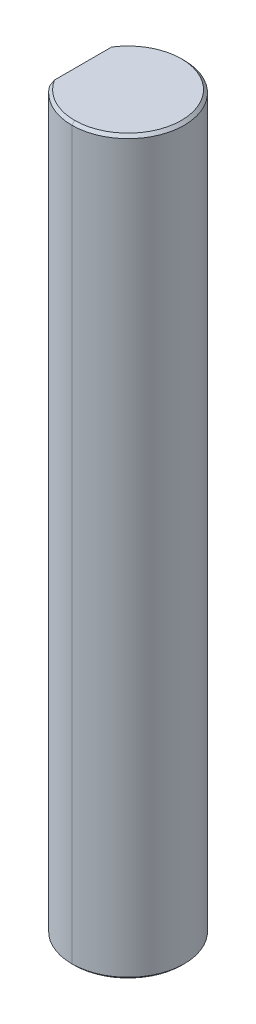
ISO-10303-21;
HEADER;
FILE_DESCRIPTION(('STEP AP214'),'2;1');
FILE_NAME('part.step','',(''),(''),'','','');
FILE_SCHEMA(('AUTOMOTIVE_DESIGN { 1 0 10303 214 1 1 1 1 }'));
ENDSEC;
DATA;
#1=APPLICATION_CONTEXT('core data for automotive mechanical design processes');
#2=APPLICATION_PROTOCOL_DEFINITION('international standard','automotive_design',2000,#1);
#3=PRODUCT_CONTEXT('',#1,'mechanical');
#4=PRODUCT('Part','Part','',(#3));
#5=PRODUCT_RELATED_PRODUCT_CATEGORY('part','',(#4));
#6=PRODUCT_DEFINITION_FORMATION('','',#4);
#7=PRODUCT_DEFINITION_CONTEXT('part definition',#1,'design');
#8=PRODUCT_DEFINITION('design','',#6,#7);
#9=PRODUCT_DEFINITION_SHAPE('','',#8);
#10=(LENGTH_UNIT() NAMED_UNIT(*) SI_UNIT(.MILLI.,.METRE.));
#11=(NAMED_UNIT(*) PLANE_ANGLE_UNIT() SI_UNIT($,.RADIAN.));
#12=(NAMED_UNIT(*) SI_UNIT($,.STERADIAN.) SOLID_ANGLE_UNIT());
#13=UNCERTAINTY_MEASURE_WITH_UNIT(LENGTH_MEASURE(1.E-05),#10,'distance_accuracy_value','');
#14=(GEOMETRIC_REPRESENTATION_CONTEXT(3) GLOBAL_UNCERTAINTY_ASSIGNED_CONTEXT((#13)) GLOBAL_UNIT_ASSIGNED_CONTEXT((#10,
#11,#12)) REPRESENTATION_CONTEXT('',''));
#15=CARTESIAN_POINT('',(0.,0.,0.));
#16=DIRECTION('',(0.,0.,1.));
#17=DIRECTION('',(1.,0.,0.));
#18=AXIS2_PLACEMENT_3D('',#15,#16,#17);
#19=CARTESIAN_POINT('',(-2.54381,203.2,-1.89353550270387));
#20=DIRECTION('',(1.,0.,0.));
#21=DIRECTION('',(0.,1.,0.));
#22=AXIS2_PLACEMENT_3D('',#19,#20,#21);
#23=PLANE('',#22);
#24=DIRECTION('',(0.,0.,1.));
#25=VECTOR('',#24,1.);
#26=CARTESIAN_POINT('',(-2.54381,41.275,-1.89353550270387));
#27=LINE('',#26,#25);
#28=CARTESIAN_POINT('',(-2.54381,41.275,-1.61363733146579));
#29=VERTEX_POINT('',#28);
#30=CARTESIAN_POINT('',(-2.54381,41.275,1.61363733146579));
#31=VERTEX_POINT('',#30);
#32=EDGE_CURVE('E181',#29,#31,#27,.T.);
#33=ORIENTED_EDGE('',*,*,#32,.F.);
#34=CARTESIAN_POINT('',(-2.54381,41.275,-1.61363733146579));
#35=CARTESIAN_POINT('',(-2.54381,41.262335972846,-1.63727892069954));
#36=CARTESIAN_POINT('',(-2.54381,41.2495182044331,-1.66083787110424));
#37=CARTESIAN_POINT('',(-2.54381,41.2235954843602,-1.70779313460009));
#38=CARTESIAN_POINT('',(-2.54381,41.2104905717043,-1.73118946921834));
#39=CARTESIAN_POINT('',(-2.54381,41.1840105768963,-1.77782826832947));
#40=CARTESIAN_POINT('',(-2.54381,41.1706354976812,-1.80107073449143));
#41=CARTESIAN_POINT('',(-2.54381,41.143629824734,-1.84741098770331));
#42=CARTESIAN_POINT('',(-2.54381,41.1299991967487,-1.87050875479637));
#43=CARTESIAN_POINT('',(-2.54381,41.11625,-1.89353550270388));
#44=B_SPLINE_CURVE_WITH_KNOTS('',3,(#34,#35,#36,#37,#38,#39,#40,#41,#42,#43),.UNSPECIFIED.,.F.,
.F.,(4,2,2,2,4),(0.,0.0804585075195979,0.160906152924477,0.241352924245912,0.321810556729116),.UNSPECIFIED.);
#45=CARTESIAN_POINT('',(-2.54381,41.11625,-1.89353550270387));
#46=VERTEX_POINT('',#45);
#47=EDGE_CURVE('E198',#29,#46,#44,.T.);
#48=ORIENTED_EDGE('',*,*,#47,.T.);
#49=DIRECTION('',(0.,-1.,0.));
#50=VECTOR('',#49,1.);
#51=CARTESIAN_POINT('',(-2.54381,203.2,-1.89353550270387));
#52=LINE('',#51,#50);
#53=CARTESIAN_POINT('',(-2.54381,0.127000000000044,-1.89353550270387));
#54=VERTEX_POINT('',#53);
#55=EDGE_CURVE('E163',#46,#54,#52,.T.);
#56=ORIENTED_EDGE('',*,*,#55,.T.);
#57=CARTESIAN_POINT('',(-2.54381,0.127000000000044,-1.89353550270387));
#58=CARTESIAN_POINT('',(-2.54381,0.0833862535559772,-1.82049357854219));
#59=CARTESIAN_POINT('',(-2.54381,0.0409575857320699,-1.74672509100728));
#60=CARTESIAN_POINT('',(-2.54381,0.,-1.67216130800824));
#61=(BOUNDED_CURVE() B_SPLINE_CURVE(3,(#57,#58,#59,#60),.UNSPECIFIED.,.F.,
.F.) B_SPLINE_CURVE_WITH_KNOTS((4,4),(0.,0.00025521664145809),
.UNSPECIFIED.) CURVE() GEOMETRIC_REPRESENTATION_ITEM() RATIONAL_B_SPLINE_CURVE((1.,1.,1.,1.)) REPRESENTATION_ITEM(''));
#62=CARTESIAN_POINT('',(-2.54381,0.,-1.67216130800824));
#63=VERTEX_POINT('',#62);
#64=EDGE_CURVE('E129',#54,#63,#61,.T.);
#65=ORIENTED_EDGE('',*,*,#64,.T.);
#66=DIRECTION('',(0.,0.,1.));
#67=VECTOR('',#66,1.);
#68=CARTESIAN_POINT('',(-2.54381,0.,-1.89353550270387));
#69=LINE('',#68,#67);
#70=CARTESIAN_POINT('',(-2.54381,0.,1.67216130800824));
#71=VERTEX_POINT('',#70);
#72=EDGE_CURVE('E123',#63,#71,#69,.T.);
#73=ORIENTED_EDGE('',*,*,#72,.T.);
#74=CARTESIAN_POINT('',(-2.54381,0.,1.67216130800824));
#75=CARTESIAN_POINT('',(-2.54381,0.040957585732076,1.74672509100728));
#76=CARTESIAN_POINT('',(-2.54381,0.0833862535559736,1.82049357854219));
#77=CARTESIAN_POINT('',(-2.54381,0.127000000000044,1.89353550270387));
#78=(BOUNDED_CURVE() B_SPLINE_CURVE(3,(#74,#75,#76,#77),.UNSPECIFIED.,.F.,
.F.) B_SPLINE_CURVE_WITH_KNOTS((4,4),(0.,0.00025521664145809),
.UNSPECIFIED.) CURVE() GEOMETRIC_REPRESENTATION_ITEM() RATIONAL_B_SPLINE_CURVE((1.,1.,1.,1.)) REPRESENTATION_ITEM(''));
#79=CARTESIAN_POINT('',(-2.54381,0.127000000000044,1.89353550270387));
#80=VERTEX_POINT('',#79);
#81=EDGE_CURVE('E126',#71,#80,#78,.T.);
#82=ORIENTED_EDGE('',*,*,#81,.T.);
#83=DIRECTION('',(0.,-1.,0.));
#84=VECTOR('',#83,1.);
#85=CARTESIAN_POINT('',(-2.54381,203.2,1.89353550270387));
#86=LINE('',#85,#84);
#87=CARTESIAN_POINT('',(-2.54381,41.11625,1.89353550270387));
#88=VERTEX_POINT('',#87);
#89=EDGE_CURVE('E166',#88,#80,#86,.T.);
#90=ORIENTED_EDGE('',*,*,#89,.F.);
#91=CARTESIAN_POINT('',(-2.54381,41.11625,1.89353550270387));
#92=CARTESIAN_POINT('',(-2.54381,41.1299991967486,1.87050875479636));
#93=CARTESIAN_POINT('',(-2.54381,41.143629824734,1.84741098770331));
#94=CARTESIAN_POINT('',(-2.54381,41.1706354976812,1.80107073449143));
#95=CARTESIAN_POINT('',(-2.54381,41.1840105768963,1.77782826832947));
#96=CARTESIAN_POINT('',(-2.54381,41.2104905717043,1.73118946921834));
#97=CARTESIAN_POINT('',(-2.54381,41.2235954843602,1.70779313460009));
#98=CARTESIAN_POINT('',(-2.54381,41.2495182044331,1.66083787110425));
#99=CARTESIAN_POINT('',(-2.54381,41.262335972846,1.63727892069955));
#100=CARTESIAN_POINT('',(-2.54381,41.275,1.61363733146582));
#101=B_SPLINE_CURVE_WITH_KNOTS('',3,(#91,#92,#93,#94,#95,#96,#97,#98,#99,#100),.UNSPECIFIED.,
.F.,.F.,(4,2,2,2,4),(0.,0.080457632483204,0.160904403804639,0.241352049209515,
0.321810556729113),.UNSPECIFIED.);
#102=EDGE_CURVE('E191',#88,#31,#101,.T.);
#103=ORIENTED_EDGE('',*,*,#102,.T.);
#104=EDGE_LOOP('',(#33,#48,#56,#65,#73,#82,#90,#103));
#105=FACE_BOUND('',#104,.T.);
#106=ADVANCED_FACE('F45',(#105),#23,.F.);
#107=CARTESIAN_POINT('',(0.,203.2,0.));
#108=DIRECTION('',(0.,-1.,0.));
#109=DIRECTION('',(0.,0.,-1.));
#110=AXIS2_PLACEMENT_3D('',#107,#108,#109);
#111=CYLINDRICAL_SURFACE('',#110,3.17119);
#112=DIRECTION('',(0.,-1.,0.));
#113=VECTOR('',#112,1.);
#114=CARTESIAN_POINT('',(0.,203.2,3.17119));
#115=LINE('',#114,#113);
#116=CARTESIAN_POINT('',(0.,41.11625,3.17119));
#117=VERTEX_POINT('',#116);
#118=CARTESIAN_POINT('',(0.,0.127000000000044,3.17119));
#119=VERTEX_POINT('',#118);
#120=EDGE_CURVE('E143',#117,#119,#115,.T.);
#121=ORIENTED_EDGE('',*,*,#120,.F.);
#122=CARTESIAN_POINT('',(0.,41.11625,0.));
#123=DIRECTION('',(0.,1.,0.));
#124=DIRECTION('',(0.,0.,1.));
#125=AXIS2_PLACEMENT_3D('',#122,#123,#124);
#126=CIRCLE('',#125,3.17119);
#127=EDGE_CURVE('E14',#117,#88,#126,.F.);
#128=ORIENTED_EDGE('',*,*,#127,.T.);
#129=ORIENTED_EDGE('',*,*,#89,.T.);
#130=CARTESIAN_POINT('',(0.,0.127000000000044,0.));
#131=DIRECTION('',(0.,1.,0.));
#132=DIRECTION('',(0.,0.,1.));
#133=AXIS2_PLACEMENT_3D('',#130,#131,#132);
#134=CIRCLE('',#133,3.17119);
#135=EDGE_CURVE('E141',#80,#119,#134,.T.);
#136=ORIENTED_EDGE('',*,*,#135,.T.);
#137=EDGE_LOOP('',(#121,#128,#129,#136));
#138=FACE_BOUND('',#137,.T.);
#139=ADVANCED_FACE('F208',(#138),#111,.T.);
#140=CARTESIAN_POINT('',(0.,203.2,0.));
#141=DIRECTION('',(0.,-1.,0.));
#142=DIRECTION('',(0.,0.,-1.));
#143=AXIS2_PLACEMENT_3D('',#140,#141,#142);
#144=CYLINDRICAL_SURFACE('',#143,3.17119);
#145=ORIENTED_EDGE('',*,*,#55,.F.);
#146=CARTESIAN_POINT('',(0.,41.11625,0.));
#147=DIRECTION('',(0.,1.,0.));
#148=DIRECTION('',(0.,0.,1.));
#149=AXIS2_PLACEMENT_3D('',#146,#147,#148);
#150=CIRCLE('',#149,3.17119);
#151=CARTESIAN_POINT('',(0.,41.11625,-3.17119));
#152=VERTEX_POINT('',#151);
#153=EDGE_CURVE('E169',#46,#152,#150,.F.);
#154=ORIENTED_EDGE('',*,*,#153,.T.);
#155=DIRECTION('',(0.,-1.,0.));
#156=VECTOR('',#155,1.);
#157=CARTESIAN_POINT('',(0.,203.2,-3.17119));
#158=LINE('',#157,#156);
#159=CARTESIAN_POINT('',(0.,0.127000000000044,-3.17119));
#160=VERTEX_POINT('',#159);
#161=EDGE_CURVE('E164',#152,#160,#158,.T.);
#162=ORIENTED_EDGE('',*,*,#161,.T.);
#163=CARTESIAN_POINT('',(0.,0.127000000000044,0.));
#164=DIRECTION('',(0.,1.,0.));
#165=DIRECTION('',(0.,0.,1.));
#166=AXIS2_PLACEMENT_3D('',#163,#164,#165);
#167=CIRCLE('',#166,3.17119);
#168=EDGE_CURVE('E160',#160,#54,#167,.T.);
#169=ORIENTED_EDGE('',*,*,#168,.T.);
#170=EDGE_LOOP('',(#145,#154,#162,#169));
#171=FACE_BOUND('',#170,.T.);
#172=ADVANCED_FACE('F242',(#171),#144,.T.);
#173=CARTESIAN_POINT('',(0.,203.2,0.));
#174=DIRECTION('',(0.,-1.,0.));
#175=DIRECTION('',(0.,0.,-1.));
#176=AXIS2_PLACEMENT_3D('',#173,#174,#175);
#177=CYLINDRICAL_SURFACE('',#176,3.17119);
#178=ORIENTED_EDGE('',*,*,#161,.F.);
#179=CARTESIAN_POINT('',(0.,41.11625,0.));
#180=DIRECTION('',(0.,1.,0.));
#181=DIRECTION('',(0.,0.,1.));
#182=AXIS2_PLACEMENT_3D('',#179,#180,#181);
#183=CIRCLE('',#182,3.17119);
#184=EDGE_CURVE('E56',#152,#117,#183,.F.);
#185=ORIENTED_EDGE('',*,*,#184,.T.);
#186=ORIENTED_EDGE('',*,*,#120,.T.);
#187=CARTESIAN_POINT('',(0.,0.127000000000044,0.));
#188=DIRECTION('',(0.,1.,0.));
#189=DIRECTION('',(0.,0.,1.));
#190=AXIS2_PLACEMENT_3D('',#187,#188,#189);
#191=CIRCLE('',#190,3.17119);
#192=EDGE_CURVE('E157',#119,#160,#191,.T.);
#193=ORIENTED_EDGE('',*,*,#192,.T.);
#194=EDGE_LOOP('',(#178,#185,#186,#193));
#195=FACE_BOUND('',#194,.T.);
#196=ADVANCED_FACE('F250',(#195),#177,.T.);
#197=CARTESIAN_POINT('',(0.,0.127000000000044,0.));
#198=DIRECTION('',(0.,1.,0.));
#199=DIRECTION('',(0.,0.,1.));
#200=AXIS2_PLACEMENT_3D('',#197,#198,#199);
#201=CONICAL_SURFACE('',#200,3.17119,0.785398163397376);
#202=DIRECTION('',(0.,0.707106781186599,-0.707106781186496));
#203=VECTOR('',#202,1.);
#204=CARTESIAN_POINT('',(0.,0.127000000000044,-3.17119));
#205=LINE('',#204,#203);
#206=CARTESIAN_POINT('',(0.,0.,-3.04419));
#207=VERTEX_POINT('',#206);
#208=EDGE_CURVE('E172',#207,#160,#205,.T.);
#209=ORIENTED_EDGE('',*,*,#208,.F.);
#210=CARTESIAN_POINT('',(0.,0.,0.));
#211=DIRECTION('',(0.,-1.,0.));
#212=DIRECTION('',(0.,0.,1.));
#213=AXIS2_PLACEMENT_3D('',#210,#211,#212);
#214=CIRCLE('',#213,3.04419);
#215=EDGE_CURVE('E133',#63,#207,#214,.T.);
#216=ORIENTED_EDGE('',*,*,#215,.F.);
#217=ORIENTED_EDGE('',*,*,#64,.F.);
#218=ORIENTED_EDGE('',*,*,#168,.F.);
#219=EDGE_LOOP('',(#209,#216,#217,#218));
#220=FACE_BOUND('',#219,.T.);
#221=ADVANCED_FACE('F246',(#220),#201,.T.);
#222=CARTESIAN_POINT('',(0.,0.,0.));
#223=DIRECTION('',(0.,1.,0.));
#224=DIRECTION('',(1.,0.,0.));
#225=AXIS2_PLACEMENT_3D('',#222,#223,#224);
#226=PLANE('',#225);
#227=ORIENTED_EDGE('',*,*,#72,.F.);
#228=ORIENTED_EDGE('',*,*,#215,.T.);
#229=CARTESIAN_POINT('',(0.,0.,0.));
#230=DIRECTION('',(0.,-1.,0.));
#231=DIRECTION('',(0.,0.,1.));
#232=AXIS2_PLACEMENT_3D('',#229,#230,#231);
#233=CIRCLE('',#232,3.04419);
#234=CARTESIAN_POINT('',(0.,0.,3.04419));
#235=VERTEX_POINT('',#234);
#236=EDGE_CURVE('E148',#207,#235,#233,.T.);
#237=ORIENTED_EDGE('',*,*,#236,.T.);
#238=CARTESIAN_POINT('',(0.,0.,0.));
#239=DIRECTION('',(0.,-1.,0.));
#240=DIRECTION('',(0.,0.,1.));
#241=AXIS2_PLACEMENT_3D('',#238,#239,#240);
#242=CIRCLE('',#241,3.04419);
#243=EDGE_CURVE('E138',#235,#71,#242,.T.);
#244=ORIENTED_EDGE('',*,*,#243,.T.);
#245=EDGE_LOOP('',(#227,#228,#237,#244));
#246=FACE_BOUND('',#245,.T.);
#247=ADVANCED_FACE('F146',(#246),#226,.F.);
#248=CARTESIAN_POINT('',(0.,0.127000000000044,0.));
#249=DIRECTION('',(0.,1.,0.));
#250=DIRECTION('',(0.,0.,1.));
#251=AXIS2_PLACEMENT_3D('',#248,#249,#250);
#252=CONICAL_SURFACE('',#251,3.17119,0.785398163397376);
#253=ORIENTED_EDGE('',*,*,#243,.F.);
#254=DIRECTION('',(0.,0.707106781186599,0.707106781186496));
#255=VECTOR('',#254,1.);
#256=CARTESIAN_POINT('',(0.,0.127000000000044,3.17119));
#257=LINE('',#256,#255);
#258=EDGE_CURVE('E150',#235,#119,#257,.T.);
#259=ORIENTED_EDGE('',*,*,#258,.T.);
#260=ORIENTED_EDGE('',*,*,#135,.F.);
#261=ORIENTED_EDGE('',*,*,#81,.F.);
#262=EDGE_LOOP('',(#253,#259,#260,#261));
#263=FACE_BOUND('',#262,.T.);
#264=ADVANCED_FACE('F136',(#263),#252,.T.);
#265=CARTESIAN_POINT('',(0.,0.127000000000044,0.));
#266=DIRECTION('',(0.,1.,0.));
#267=DIRECTION('',(0.,0.,1.));
#268=AXIS2_PLACEMENT_3D('',#265,#266,#267);
#269=CONICAL_SURFACE('',#268,3.17119,0.785398163397376);
#270=ORIENTED_EDGE('',*,*,#236,.F.);
#271=ORIENTED_EDGE('',*,*,#208,.T.);
#272=ORIENTED_EDGE('',*,*,#192,.F.);
#273=ORIENTED_EDGE('',*,*,#258,.F.);
#274=EDGE_LOOP('',(#270,#271,#272,#273));
#275=FACE_BOUND('',#274,.T.);
#276=ADVANCED_FACE('F249',(#275),#269,.T.);
#277=CARTESIAN_POINT('',(3.17119,41.275,-3.17119));
#278=DIRECTION('',(0.,1.,0.));
#279=DIRECTION('',(0.,0.,1.));
#280=AXIS2_PLACEMENT_3D('',#277,#278,#279);
#281=PLANE('',#280);
#282=CARTESIAN_POINT('',(0.,41.275,0.));
#283=DIRECTION('',(0.,1.,0.));
#284=DIRECTION('',(0.,0.,1.));
#285=AXIS2_PLACEMENT_3D('',#282,#283,#284);
#286=CIRCLE('',#285,3.01244000000001);
#287=CARTESIAN_POINT('',(0.,41.275,3.01244000000001));
#288=VERTEX_POINT('',#287);
#289=CARTESIAN_POINT('',(0.,41.275,-3.01244000000001));
#290=VERTEX_POINT('',#289);
#291=EDGE_CURVE('E187',#288,#290,#286,.T.);
#292=ORIENTED_EDGE('',*,*,#291,.T.);
#293=CARTESIAN_POINT('',(0.,41.275,0.));
#294=DIRECTION('',(0.,1.,0.));
#295=DIRECTION('',(0.,0.,1.));
#296=AXIS2_PLACEMENT_3D('',#293,#294,#295);
#297=CIRCLE('',#296,3.01244000000001);
#298=EDGE_CURVE('E189',#290,#29,#297,.T.);
#299=ORIENTED_EDGE('',*,*,#298,.T.);
#300=ORIENTED_EDGE('',*,*,#32,.T.);
#301=CARTESIAN_POINT('',(0.,41.275,0.));
#302=DIRECTION('',(0.,1.,0.));
#303=DIRECTION('',(0.,0.,1.));
#304=AXIS2_PLACEMENT_3D('',#301,#302,#303);
#305=CIRCLE('',#304,3.01244000000001);
#306=EDGE_CURVE('E185',#31,#288,#305,.T.);
#307=ORIENTED_EDGE('',*,*,#306,.T.);
#308=EDGE_LOOP('',(#292,#299,#300,#307));
#309=FACE_BOUND('',#308,.T.);
#310=ADVANCED_FACE('F227',(#309),#281,.T.);
#311=CARTESIAN_POINT('',(0.,41.11625,0.));
#312=DIRECTION('',(0.,-1.,0.));
#313=DIRECTION('',(0.,0.,-1.));
#314=AXIS2_PLACEMENT_3D('',#311,#312,#313);
#315=CONICAL_SURFACE('',#314,3.17119,0.785398163397407);
#316=ORIENTED_EDGE('',*,*,#102,.F.);
#317=ORIENTED_EDGE('',*,*,#127,.F.);
#318=DIRECTION('',(0.,-0.707106781186576,0.707106781186518));
#319=VECTOR('',#318,1.);
#320=CARTESIAN_POINT('',(0.,41.275,3.01244000000001));
#321=LINE('',#320,#319);
#322=EDGE_CURVE('E51',#288,#117,#321,.T.);
#323=ORIENTED_EDGE('',*,*,#322,.F.);
#324=ORIENTED_EDGE('',*,*,#306,.F.);
#325=EDGE_LOOP('',(#316,#317,#323,#324));
#326=FACE_BOUND('',#325,.T.);
#327=ADVANCED_FACE('F48',(#326),#315,.T.);
#328=CARTESIAN_POINT('',(0.,41.11625,0.));
#329=DIRECTION('',(0.,-1.,0.));
#330=DIRECTION('',(0.,0.,-1.));
#331=AXIS2_PLACEMENT_3D('',#328,#329,#330);
#332=CONICAL_SURFACE('',#331,3.17119,0.785398163397407);
#333=ORIENTED_EDGE('',*,*,#322,.T.);
#334=ORIENTED_EDGE('',*,*,#184,.F.);
#335=DIRECTION('',(0.,-0.707106781186576,-0.707106781186518));
#336=VECTOR('',#335,1.);
#337=CARTESIAN_POINT('',(0.,41.275,-3.01244000000001));
#338=LINE('',#337,#336);
#339=EDGE_CURVE('E234',#290,#152,#338,.T.);
#340=ORIENTED_EDGE('',*,*,#339,.F.);
#341=ORIENTED_EDGE('',*,*,#291,.F.);
#342=EDGE_LOOP('',(#333,#334,#340,#341));
#343=FACE_BOUND('',#342,.T.);
#344=ADVANCED_FACE('F218',(#343),#332,.T.);
#345=CARTESIAN_POINT('',(0.,41.11625,0.));
#346=DIRECTION('',(0.,-1.,0.));
#347=DIRECTION('',(0.,0.,-1.));
#348=AXIS2_PLACEMENT_3D('',#345,#346,#347);
#349=CONICAL_SURFACE('',#348,3.17119,0.785398163397407);
#350=ORIENTED_EDGE('',*,*,#47,.F.);
#351=ORIENTED_EDGE('',*,*,#298,.F.);
#352=ORIENTED_EDGE('',*,*,#339,.T.);
#353=ORIENTED_EDGE('',*,*,#153,.F.);
#354=EDGE_LOOP('',(#350,#351,#352,#353));
#355=FACE_BOUND('',#354,.T.);
#356=ADVANCED_FACE('F211',(#355),#349,.T.);
#357=CLOSED_SHELL('',(#106,#139,#172,#196,#221,#247,#264,#276,#310,#327,#344,#356));
#358=MANIFOLD_SOLID_BREP('B2',#357);
#359=ADVANCED_BREP_SHAPE_REPRESENTATION('',(#18,#358),#14);
#360=SHAPE_DEFINITION_REPRESENTATION(#9,#359);
ENDSEC;
END-ISO-10303-21;
